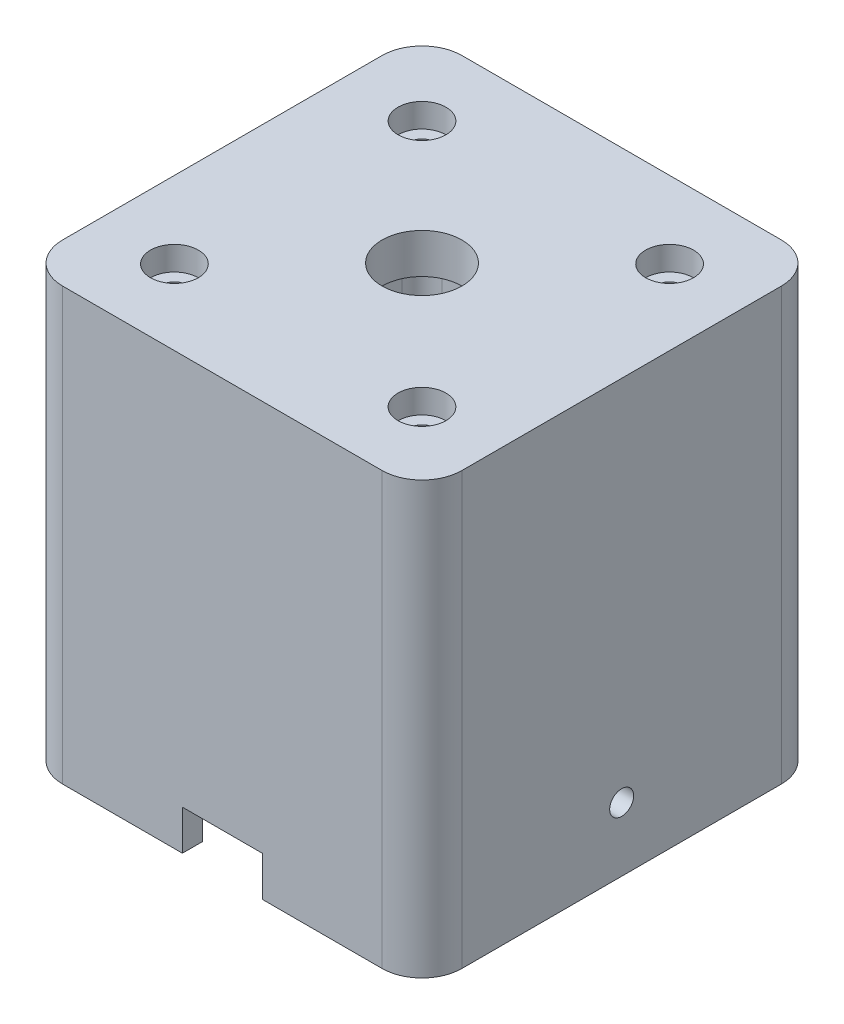
ISO-10303-21;
HEADER;
FILE_DESCRIPTION(('STEP AP214'),'2;1');
FILE_NAME('part.step','',(''),(''),'','','');
FILE_SCHEMA(('AUTOMOTIVE_DESIGN { 1 0 10303 214 1 1 1 1 }'));
ENDSEC;
DATA;
#1=APPLICATION_CONTEXT('core data for automotive mechanical design processes');
#2=APPLICATION_PROTOCOL_DEFINITION('international standard','automotive_design',2000,#1);
#3=PRODUCT_CONTEXT('',#1,'mechanical');
#4=PRODUCT('Part','Part','',(#3));
#5=PRODUCT_RELATED_PRODUCT_CATEGORY('part','',(#4));
#6=PRODUCT_DEFINITION_FORMATION('','',#4);
#7=PRODUCT_DEFINITION_CONTEXT('part definition',#1,'design');
#8=PRODUCT_DEFINITION('design','',#6,#7);
#9=PRODUCT_DEFINITION_SHAPE('','',#8);
#10=(LENGTH_UNIT() NAMED_UNIT(*) SI_UNIT(.MILLI.,.METRE.));
#11=(NAMED_UNIT(*) PLANE_ANGLE_UNIT() SI_UNIT($,.RADIAN.));
#12=(NAMED_UNIT(*) SI_UNIT($,.STERADIAN.) SOLID_ANGLE_UNIT());
#13=UNCERTAINTY_MEASURE_WITH_UNIT(LENGTH_MEASURE(1.E-05),#10,'distance_accuracy_value','');
#14=(GEOMETRIC_REPRESENTATION_CONTEXT(3) GLOBAL_UNCERTAINTY_ASSIGNED_CONTEXT((#13)) GLOBAL_UNIT_ASSIGNED_CONTEXT((#10,
#11,#12)) REPRESENTATION_CONTEXT('',''));
#15=CARTESIAN_POINT('',(0.,0.,0.));
#16=DIRECTION('',(0.,0.,1.));
#17=DIRECTION('',(1.,0.,0.));
#18=AXIS2_PLACEMENT_3D('',#15,#16,#17);
#19=CARTESIAN_POINT('',(-20.,47.,-20.));
#20=DIRECTION('',(0.,-1.,0.));
#21=DIRECTION('',(0.,0.,-1.));
#22=AXIS2_PLACEMENT_3D('',#19,#20,#21);
#23=CYLINDRICAL_SURFACE('',#22,2.5);
#24=DIRECTION('',(0.,1.,0.));
#25=VECTOR('',#24,1.);
#26=CARTESIAN_POINT('',(-22.5,47.,-20.));
#27=LINE('',#26,#25);
#28=CARTESIAN_POINT('',(-22.5,0.,-20.));
#29=VERTEX_POINT('',#28);
#30=CARTESIAN_POINT('',(-22.5,47.,-20.));
#31=VERTEX_POINT('',#30);
#32=EDGE_CURVE('E332',#29,#31,#27,.T.);
#33=ORIENTED_EDGE('',*,*,#32,.F.);
#34=CARTESIAN_POINT('',(-20.,0.,-20.));
#35=DIRECTION('',(0.,1.,0.));
#36=DIRECTION('',(0.,0.,1.));
#37=AXIS2_PLACEMENT_3D('',#34,#35,#36);
#38=CIRCLE('',#37,2.5);
#39=CARTESIAN_POINT('',(-20.,0.,-22.5));
#40=VERTEX_POINT('',#39);
#41=EDGE_CURVE('E339',#29,#40,#38,.F.);
#42=ORIENTED_EDGE('',*,*,#41,.T.);
#43=DIRECTION('',(0.,1.,0.));
#44=VECTOR('',#43,1.);
#45=CARTESIAN_POINT('',(-20.,47.,-22.5));
#46=LINE('',#45,#44);
#47=CARTESIAN_POINT('',(-20.,47.,-22.5));
#48=VERTEX_POINT('',#47);
#49=EDGE_CURVE('E335',#48,#40,#46,.F.);
#50=ORIENTED_EDGE('',*,*,#49,.F.);
#51=CARTESIAN_POINT('',(-20.,47.,-20.));
#52=DIRECTION('',(0.,1.,0.));
#53=DIRECTION('',(0.,0.,1.));
#54=AXIS2_PLACEMENT_3D('',#51,#52,#53);
#55=CIRCLE('',#54,2.5);
#56=EDGE_CURVE('E56',#31,#48,#55,.F.);
#57=ORIENTED_EDGE('',*,*,#56,.F.);
#58=EDGE_LOOP('',(#33,#42,#50,#57));
#59=FACE_BOUND('',#58,.T.);
#60=ADVANCED_FACE('F32',(#59),#23,.F.);
#61=CARTESIAN_POINT('',(20.,47.,-20.));
#62=DIRECTION('',(0.,-1.,0.));
#63=DIRECTION('',(0.,0.,-1.));
#64=AXIS2_PLACEMENT_3D('',#61,#62,#63);
#65=CYLINDRICAL_SURFACE('',#64,2.5);
#66=DIRECTION('',(0.,1.,0.));
#67=VECTOR('',#66,1.);
#68=CARTESIAN_POINT('',(20.,47.,-22.5));
#69=LINE('',#68,#67);
#70=CARTESIAN_POINT('',(20.,0.,-22.5));
#71=VERTEX_POINT('',#70);
#72=CARTESIAN_POINT('',(20.,47.,-22.5));
#73=VERTEX_POINT('',#72);
#74=EDGE_CURVE('E322',#71,#73,#69,.T.);
#75=ORIENTED_EDGE('',*,*,#74,.F.);
#76=CARTESIAN_POINT('',(20.,0.,-20.));
#77=DIRECTION('',(0.,1.,0.));
#78=DIRECTION('',(0.,0.,1.));
#79=AXIS2_PLACEMENT_3D('',#76,#77,#78);
#80=CIRCLE('',#79,2.5);
#81=CARTESIAN_POINT('',(22.5,0.,-20.));
#82=VERTEX_POINT('',#81);
#83=EDGE_CURVE('E330',#71,#82,#80,.F.);
#84=ORIENTED_EDGE('',*,*,#83,.T.);
#85=DIRECTION('',(0.,1.,0.));
#86=VECTOR('',#85,1.);
#87=CARTESIAN_POINT('',(22.5,47.,-20.));
#88=LINE('',#87,#86);
#89=CARTESIAN_POINT('',(22.5,47.,-20.));
#90=VERTEX_POINT('',#89);
#91=EDGE_CURVE('E325',#90,#82,#88,.F.);
#92=ORIENTED_EDGE('',*,*,#91,.F.);
#93=CARTESIAN_POINT('',(20.,47.,-20.));
#94=DIRECTION('',(0.,1.,0.));
#95=DIRECTION('',(0.,0.,1.));
#96=AXIS2_PLACEMENT_3D('',#93,#94,#95);
#97=CIRCLE('',#96,2.5);
#98=EDGE_CURVE('E328',#73,#90,#97,.F.);
#99=ORIENTED_EDGE('',*,*,#98,.F.);
#100=EDGE_LOOP('',(#75,#84,#92,#99));
#101=FACE_BOUND('',#100,.T.);
#102=ADVANCED_FACE('F438',(#101),#65,.F.);
#103=CARTESIAN_POINT('',(20.,47.,20.));
#104=DIRECTION('',(0.,1.,0.));
#105=DIRECTION('',(0.,0.,1.));
#106=AXIS2_PLACEMENT_3D('',#103,#104,#105);
#107=CYLINDRICAL_SURFACE('',#106,2.5);
#108=DIRECTION('',(0.,-1.,0.));
#109=VECTOR('',#108,1.);
#110=CARTESIAN_POINT('',(20.,47.,22.5));
#111=LINE('',#110,#109);
#112=CARTESIAN_POINT('',(20.,47.,22.5));
#113=VERTEX_POINT('',#112);
#114=CARTESIAN_POINT('',(20.,0.,22.5));
#115=VERTEX_POINT('',#114);
#116=EDGE_CURVE('E311',#113,#115,#111,.T.);
#117=ORIENTED_EDGE('',*,*,#116,.F.);
#118=CARTESIAN_POINT('',(20.,47.,20.));
#119=DIRECTION('',(0.,1.,0.));
#120=DIRECTION('',(0.,0.,1.));
#121=AXIS2_PLACEMENT_3D('',#118,#119,#120);
#122=CIRCLE('',#121,2.5);
#123=CARTESIAN_POINT('',(22.5,47.,20.));
#124=VERTEX_POINT('',#123);
#125=EDGE_CURVE('E317',#124,#113,#122,.F.);
#126=ORIENTED_EDGE('',*,*,#125,.F.);
#127=DIRECTION('',(0.,-1.,0.));
#128=VECTOR('',#127,1.);
#129=CARTESIAN_POINT('',(22.5,47.,20.));
#130=LINE('',#129,#128);
#131=CARTESIAN_POINT('',(22.5,0.,20.));
#132=VERTEX_POINT('',#131);
#133=EDGE_CURVE('E314',#132,#124,#130,.F.);
#134=ORIENTED_EDGE('',*,*,#133,.F.);
#135=CARTESIAN_POINT('',(20.,0.,20.));
#136=DIRECTION('',(0.,1.,0.));
#137=DIRECTION('',(0.,0.,1.));
#138=AXIS2_PLACEMENT_3D('',#135,#136,#137);
#139=CIRCLE('',#138,2.5);
#140=EDGE_CURVE('E319',#132,#115,#139,.F.);
#141=ORIENTED_EDGE('',*,*,#140,.T.);
#142=EDGE_LOOP('',(#117,#126,#134,#141));
#143=FACE_BOUND('',#142,.T.);
#144=ADVANCED_FACE('F429',(#143),#107,.F.);
#145=CARTESIAN_POINT('',(-20.,47.,20.));
#146=DIRECTION('',(0.,1.,0.));
#147=DIRECTION('',(0.,0.,1.));
#148=AXIS2_PLACEMENT_3D('',#145,#146,#147);
#149=CYLINDRICAL_SURFACE('',#148,2.5);
#150=DIRECTION('',(0.,-1.,0.));
#151=VECTOR('',#150,1.);
#152=CARTESIAN_POINT('',(-22.5,47.,20.));
#153=LINE('',#152,#151);
#154=CARTESIAN_POINT('',(-22.5,47.,20.));
#155=VERTEX_POINT('',#154);
#156=CARTESIAN_POINT('',(-22.5,0.,20.));
#157=VERTEX_POINT('',#156);
#158=EDGE_CURVE('E299',#155,#157,#153,.T.);
#159=ORIENTED_EDGE('',*,*,#158,.F.);
#160=CARTESIAN_POINT('',(-20.,47.,20.));
#161=DIRECTION('',(0.,1.,0.));
#162=DIRECTION('',(0.,0.,1.));
#163=AXIS2_PLACEMENT_3D('',#160,#161,#162);
#164=CIRCLE('',#163,2.5);
#165=CARTESIAN_POINT('',(-20.,47.,22.5));
#166=VERTEX_POINT('',#165);
#167=EDGE_CURVE('E305',#166,#155,#164,.F.);
#168=ORIENTED_EDGE('',*,*,#167,.F.);
#169=DIRECTION('',(0.,-1.,0.));
#170=VECTOR('',#169,1.);
#171=CARTESIAN_POINT('',(-20.,47.,22.5));
#172=LINE('',#171,#170);
#173=CARTESIAN_POINT('',(-20.,0.,22.5));
#174=VERTEX_POINT('',#173);
#175=EDGE_CURVE('E302',#174,#166,#172,.F.);
#176=ORIENTED_EDGE('',*,*,#175,.F.);
#177=CARTESIAN_POINT('',(-20.,0.,20.));
#178=DIRECTION('',(0.,1.,0.));
#179=DIRECTION('',(0.,0.,1.));
#180=AXIS2_PLACEMENT_3D('',#177,#178,#179);
#181=CIRCLE('',#180,2.5);
#182=EDGE_CURVE('E308',#174,#157,#181,.F.);
#183=ORIENTED_EDGE('',*,*,#182,.T.);
#184=EDGE_LOOP('',(#159,#168,#176,#183));
#185=FACE_BOUND('',#184,.T.);
#186=ADVANCED_FACE('F449',(#185),#149,.F.);
#187=CARTESIAN_POINT('',(-20.,47.,20.));
#188=DIRECTION('',(0.,-1.,0.));
#189=DIRECTION('',(0.,0.,-1.));
#190=AXIS2_PLACEMENT_3D('',#187,#188,#189);
#191=CYLINDRICAL_SURFACE('',#190,5.);
#192=DIRECTION('',(0.,-1.,0.));
#193=VECTOR('',#192,1.);
#194=CARTESIAN_POINT('',(-20.,47.,25.));
#195=LINE('',#194,#193);
#196=CARTESIAN_POINT('',(-20.,54.,25.));
#197=VERTEX_POINT('',#196);
#198=CARTESIAN_POINT('',(-20.,0.,25.));
#199=VERTEX_POINT('',#198);
#200=EDGE_CURVE('E289',#197,#199,#195,.T.);
#201=ORIENTED_EDGE('',*,*,#200,.F.);
#202=CARTESIAN_POINT('',(-20.,54.,20.));
#203=DIRECTION('',(0.,1.,0.));
#204=DIRECTION('',(0.,0.,1.));
#205=AXIS2_PLACEMENT_3D('',#202,#203,#204);
#206=CIRCLE('',#205,5.);
#207=CARTESIAN_POINT('',(-25.,54.,20.));
#208=VERTEX_POINT('',#207);
#209=EDGE_CURVE('E295',#208,#197,#206,.T.);
#210=ORIENTED_EDGE('',*,*,#209,.F.);
#211=DIRECTION('',(0.,-1.,0.));
#212=VECTOR('',#211,1.);
#213=CARTESIAN_POINT('',(-25.,47.,20.));
#214=LINE('',#213,#212);
#215=CARTESIAN_POINT('',(-25.,0.,20.));
#216=VERTEX_POINT('',#215);
#217=EDGE_CURVE('E292',#216,#208,#214,.F.);
#218=ORIENTED_EDGE('',*,*,#217,.F.);
#219=CARTESIAN_POINT('',(-20.,0.,20.));
#220=DIRECTION('',(0.,1.,0.));
#221=DIRECTION('',(0.,0.,1.));
#222=AXIS2_PLACEMENT_3D('',#219,#220,#221);
#223=CIRCLE('',#222,5.);
#224=EDGE_CURVE('E297',#199,#216,#223,.F.);
#225=ORIENTED_EDGE('',*,*,#224,.F.);
#226=EDGE_LOOP('',(#201,#210,#218,#225));
#227=FACE_BOUND('',#226,.T.);
#228=ADVANCED_FACE('F477',(#227),#191,.T.);
#229=CARTESIAN_POINT('',(-20.,47.,-20.));
#230=DIRECTION('',(0.,1.,0.));
#231=DIRECTION('',(0.,0.,1.));
#232=AXIS2_PLACEMENT_3D('',#229,#230,#231);
#233=CYLINDRICAL_SURFACE('',#232,5.);
#234=DIRECTION('',(0.,1.,0.));
#235=VECTOR('',#234,1.);
#236=CARTESIAN_POINT('',(-20.,47.,-25.));
#237=LINE('',#236,#235);
#238=CARTESIAN_POINT('',(-20.,0.,-25.));
#239=VERTEX_POINT('',#238);
#240=CARTESIAN_POINT('',(-20.,54.,-25.));
#241=VERTEX_POINT('',#240);
#242=EDGE_CURVE('E279',#239,#241,#237,.T.);
#243=ORIENTED_EDGE('',*,*,#242,.F.);
#244=CARTESIAN_POINT('',(-20.,0.,-20.));
#245=DIRECTION('',(0.,1.,0.));
#246=DIRECTION('',(0.,0.,1.));
#247=AXIS2_PLACEMENT_3D('',#244,#245,#246);
#248=CIRCLE('',#247,5.);
#249=CARTESIAN_POINT('',(-25.,0.,-20.));
#250=VERTEX_POINT('',#249);
#251=EDGE_CURVE('E285',#250,#239,#248,.F.);
#252=ORIENTED_EDGE('',*,*,#251,.F.);
#253=DIRECTION('',(0.,1.,0.));
#254=VECTOR('',#253,1.);
#255=CARTESIAN_POINT('',(-25.,47.,-20.));
#256=LINE('',#255,#254);
#257=CARTESIAN_POINT('',(-25.,54.,-20.));
#258=VERTEX_POINT('',#257);
#259=EDGE_CURVE('E282',#258,#250,#256,.F.);
#260=ORIENTED_EDGE('',*,*,#259,.F.);
#261=CARTESIAN_POINT('',(-20.,54.,-20.));
#262=DIRECTION('',(0.,1.,0.));
#263=DIRECTION('',(0.,0.,1.));
#264=AXIS2_PLACEMENT_3D('',#261,#262,#263);
#265=CIRCLE('',#264,5.);
#266=EDGE_CURVE('E287',#241,#258,#265,.T.);
#267=ORIENTED_EDGE('',*,*,#266,.F.);
#268=EDGE_LOOP('',(#243,#252,#260,#267));
#269=FACE_BOUND('',#268,.T.);
#270=ADVANCED_FACE('F480',(#269),#233,.T.);
#271=CARTESIAN_POINT('',(20.,47.,-20.));
#272=DIRECTION('',(0.,1.,0.));
#273=DIRECTION('',(0.,0.,1.));
#274=AXIS2_PLACEMENT_3D('',#271,#272,#273);
#275=CYLINDRICAL_SURFACE('',#274,5.);
#276=DIRECTION('',(0.,1.,0.));
#277=VECTOR('',#276,1.);
#278=CARTESIAN_POINT('',(25.,47.,-20.));
#279=LINE('',#278,#277);
#280=CARTESIAN_POINT('',(25.,0.,-20.));
#281=VERTEX_POINT('',#280);
#282=CARTESIAN_POINT('',(25.,54.,-20.));
#283=VERTEX_POINT('',#282);
#284=EDGE_CURVE('E269',#281,#283,#279,.T.);
#285=ORIENTED_EDGE('',*,*,#284,.F.);
#286=CARTESIAN_POINT('',(20.,0.,-20.));
#287=DIRECTION('',(0.,1.,0.));
#288=DIRECTION('',(0.,0.,1.));
#289=AXIS2_PLACEMENT_3D('',#286,#287,#288);
#290=CIRCLE('',#289,5.);
#291=CARTESIAN_POINT('',(20.,0.,-25.));
#292=VERTEX_POINT('',#291);
#293=EDGE_CURVE('E275',#292,#281,#290,.F.);
#294=ORIENTED_EDGE('',*,*,#293,.F.);
#295=DIRECTION('',(0.,1.,0.));
#296=VECTOR('',#295,1.);
#297=CARTESIAN_POINT('',(20.,47.,-25.));
#298=LINE('',#297,#296);
#299=CARTESIAN_POINT('',(20.,54.,-25.));
#300=VERTEX_POINT('',#299);
#301=EDGE_CURVE('E272',#300,#292,#298,.F.);
#302=ORIENTED_EDGE('',*,*,#301,.F.);
#303=CARTESIAN_POINT('',(20.,54.,-20.));
#304=DIRECTION('',(0.,1.,0.));
#305=DIRECTION('',(0.,0.,1.));
#306=AXIS2_PLACEMENT_3D('',#303,#304,#305);
#307=CIRCLE('',#306,5.);
#308=EDGE_CURVE('E277',#283,#300,#307,.T.);
#309=ORIENTED_EDGE('',*,*,#308,.F.);
#310=EDGE_LOOP('',(#285,#294,#302,#309));
#311=FACE_BOUND('',#310,.T.);
#312=ADVANCED_FACE('F415',(#311),#275,.T.);
#313=CARTESIAN_POINT('',(20.,47.,20.));
#314=DIRECTION('',(0.,1.,0.));
#315=DIRECTION('',(0.,0.,1.));
#316=AXIS2_PLACEMENT_3D('',#313,#314,#315);
#317=CYLINDRICAL_SURFACE('',#316,5.);
#318=DIRECTION('',(0.,1.,0.));
#319=VECTOR('',#318,1.);
#320=CARTESIAN_POINT('',(20.,47.,25.));
#321=LINE('',#320,#319);
#322=CARTESIAN_POINT('',(20.,0.,25.));
#323=VERTEX_POINT('',#322);
#324=CARTESIAN_POINT('',(20.,54.,25.));
#325=VERTEX_POINT('',#324);
#326=EDGE_CURVE('E258',#323,#325,#321,.T.);
#327=ORIENTED_EDGE('',*,*,#326,.F.);
#328=CARTESIAN_POINT('',(20.,0.,20.));
#329=DIRECTION('',(0.,1.,0.));
#330=DIRECTION('',(0.,0.,1.));
#331=AXIS2_PLACEMENT_3D('',#328,#329,#330);
#332=CIRCLE('',#331,5.);
#333=CARTESIAN_POINT('',(25.,0.,20.));
#334=VERTEX_POINT('',#333);
#335=EDGE_CURVE('E264',#334,#323,#332,.F.);
#336=ORIENTED_EDGE('',*,*,#335,.F.);
#337=DIRECTION('',(0.,1.,0.));
#338=VECTOR('',#337,1.);
#339=CARTESIAN_POINT('',(25.,47.,20.));
#340=LINE('',#339,#338);
#341=CARTESIAN_POINT('',(25.,54.,20.));
#342=VERTEX_POINT('',#341);
#343=EDGE_CURVE('E261',#342,#334,#340,.F.);
#344=ORIENTED_EDGE('',*,*,#343,.F.);
#345=CARTESIAN_POINT('',(20.,54.,20.));
#346=DIRECTION('',(0.,1.,0.));
#347=DIRECTION('',(0.,0.,1.));
#348=AXIS2_PLACEMENT_3D('',#345,#346,#347);
#349=CIRCLE('',#348,5.);
#350=EDGE_CURVE('E267',#325,#342,#349,.T.);
#351=ORIENTED_EDGE('',*,*,#350,.F.);
#352=EDGE_LOOP('',(#327,#336,#344,#351));
#353=FACE_BOUND('',#352,.T.);
#354=ADVANCED_FACE('F422',(#353),#317,.T.);
#355=CARTESIAN_POINT('',(0.,0.,0.));
#356=DIRECTION('',(0.,1.,0.));
#357=DIRECTION('',(0.,0.,1.));
#358=AXIS2_PLACEMENT_3D('',#355,#356,#357);
#359=PLANE('',#358);
#360=DIRECTION('',(1.,0.,0.));
#361=VECTOR('',#360,1.);
#362=CARTESIAN_POINT('',(-25.,0.,25.));
#363=LINE('',#362,#361);
#364=CARTESIAN_POINT('',(5.,0.,25.));
#365=VERTEX_POINT('',#364);
#366=EDGE_CURVE('E255',#365,#323,#363,.T.);
#367=ORIENTED_EDGE('',*,*,#366,.F.);
#368=DIRECTION('',(0.,0.,1.));
#369=VECTOR('',#368,1.);
#370=CARTESIAN_POINT('',(5.,0.,12.));
#371=LINE('',#370,#369);
#372=CARTESIAN_POINT('',(5.,0.,22.5));
#373=VERTEX_POINT('',#372);
#374=EDGE_CURVE('E184',#373,#365,#371,.T.);
#375=ORIENTED_EDGE('',*,*,#374,.F.);
#376=DIRECTION('',(1.,0.,0.));
#377=VECTOR('',#376,1.);
#378=CARTESIAN_POINT('',(-22.5,0.,22.5));
#379=LINE('',#378,#377);
#380=EDGE_CURVE('E244',#373,#115,#379,.T.);
#381=ORIENTED_EDGE('',*,*,#380,.T.);
#382=ORIENTED_EDGE('',*,*,#140,.F.);
#383=DIRECTION('',(0.,0.,-1.));
#384=VECTOR('',#383,1.);
#385=CARTESIAN_POINT('',(22.5,0.,-22.5));
#386=LINE('',#385,#384);
#387=EDGE_CURVE('E223',#132,#82,#386,.T.);
#388=ORIENTED_EDGE('',*,*,#387,.T.);
#389=ORIENTED_EDGE('',*,*,#83,.F.);
#390=DIRECTION('',(-1.,0.,0.));
#391=VECTOR('',#390,1.);
#392=CARTESIAN_POINT('',(-22.5,0.,-22.5));
#393=LINE('',#392,#391);
#394=EDGE_CURVE('E239',#71,#40,#393,.T.);
#395=ORIENTED_EDGE('',*,*,#394,.T.);
#396=ORIENTED_EDGE('',*,*,#41,.F.);
#397=DIRECTION('',(0.,0.,1.));
#398=VECTOR('',#397,1.);
#399=CARTESIAN_POINT('',(-22.5,0.,-22.5));
#400=LINE('',#399,#398);
#401=EDGE_CURVE('E242',#29,#157,#400,.T.);
#402=ORIENTED_EDGE('',*,*,#401,.T.);
#403=ORIENTED_EDGE('',*,*,#182,.F.);
#404=CARTESIAN_POINT('',(-5.,0.,22.5));
#405=VERTEX_POINT('',#404);
#406=EDGE_CURVE('E228',#174,#405,#379,.T.);
#407=ORIENTED_EDGE('',*,*,#406,.T.);
#408=DIRECTION('',(0.,0.,1.));
#409=VECTOR('',#408,1.);
#410=CARTESIAN_POINT('',(-5.,0.,12.));
#411=LINE('',#410,#409);
#412=CARTESIAN_POINT('',(-5.,0.,25.));
#413=VERTEX_POINT('',#412);
#414=EDGE_CURVE('E197',#405,#413,#411,.T.);
#415=ORIENTED_EDGE('',*,*,#414,.T.);
#416=EDGE_CURVE('E256',#199,#413,#363,.T.);
#417=ORIENTED_EDGE('',*,*,#416,.F.);
#418=ORIENTED_EDGE('',*,*,#224,.T.);
#419=DIRECTION('',(0.,0.,1.));
#420=VECTOR('',#419,1.);
#421=CARTESIAN_POINT('',(-25.,0.,-25.));
#422=LINE('',#421,#420);
#423=EDGE_CURVE('E252',#250,#216,#422,.T.);
#424=ORIENTED_EDGE('',*,*,#423,.F.);
#425=ORIENTED_EDGE('',*,*,#251,.T.);
#426=DIRECTION('',(-1.,0.,0.));
#427=VECTOR('',#426,1.);
#428=CARTESIAN_POINT('',(-25.,0.,-25.));
#429=LINE('',#428,#427);
#430=EDGE_CURVE('E249',#292,#239,#429,.T.);
#431=ORIENTED_EDGE('',*,*,#430,.F.);
#432=ORIENTED_EDGE('',*,*,#293,.T.);
#433=DIRECTION('',(0.,0.,-1.));
#434=VECTOR('',#433,1.);
#435=CARTESIAN_POINT('',(25.,0.,-25.));
#436=LINE('',#435,#434);
#437=EDGE_CURVE('E236',#334,#281,#436,.T.);
#438=ORIENTED_EDGE('',*,*,#437,.F.);
#439=ORIENTED_EDGE('',*,*,#335,.T.);
#440=EDGE_LOOP('',(#367,#375,#381,#382,#388,#389,#395,#396,#402,#403,#407,#415,#417,#418,#424,
#425,#431,#432,#438,#439));
#441=FACE_BOUND('',#440,.T.);
#442=ADVANCED_FACE('F404',(#441),#359,.F.);
#443=CARTESIAN_POINT('',(25.,47.,-25.));
#444=DIRECTION('',(-1.,0.,0.));
#445=DIRECTION('',(0.,0.,1.));
#446=AXIS2_PLACEMENT_3D('',#443,#444,#445);
#447=PLANE('',#446);
#448=CARTESIAN_POINT('',(25.,8.,1.05518735688169E-13));
#449=DIRECTION('',(1.,0.,0.));
#450=DIRECTION('',(0.,0.,-1.));
#451=AXIS2_PLACEMENT_3D('',#448,#449,#450);
#452=CIRCLE('',#451,1.50000000000002);
#453=CARTESIAN_POINT('',(25.,8.,-1.49999999999991));
#454=VERTEX_POINT('',#453);
#455=EDGE_CURVE('E345',#454,#454,#452,.T.);
#456=ORIENTED_EDGE('',*,*,#455,.F.);
#457=EDGE_LOOP('',(#456));
#458=FACE_BOUND('',#457,.T.);
#459=ORIENTED_EDGE('',*,*,#437,.T.);
#460=ORIENTED_EDGE('',*,*,#284,.T.);
#461=DIRECTION('',(0.,0.,-1.));
#462=VECTOR('',#461,1.);
#463=CARTESIAN_POINT('',(25.,54.,-25.));
#464=LINE('',#463,#462);
#465=EDGE_CURVE('E210',#342,#283,#464,.T.);
#466=ORIENTED_EDGE('',*,*,#465,.F.);
#467=ORIENTED_EDGE('',*,*,#343,.T.);
#468=EDGE_LOOP('',(#459,#460,#466,#467));
#469=FACE_BOUND('',#468,.T.);
#470=ADVANCED_FACE('F400',(#458,#469),#447,.F.);
#471=CARTESIAN_POINT('',(-25.,47.,-25.));
#472=DIRECTION('',(0.,0.,1.));
#473=DIRECTION('',(1.,0.,0.));
#474=AXIS2_PLACEMENT_3D('',#471,#472,#473);
#475=PLANE('',#474);
#476=CARTESIAN_POINT('',(3.67379836101404E-13,8.,-25.));
#477=DIRECTION('',(0.,0.,-1.));
#478=DIRECTION('',(-1.,0.,0.));
#479=AXIS2_PLACEMENT_3D('',#476,#477,#478);
#480=CIRCLE('',#479,1.50000000000002);
#481=CARTESIAN_POINT('',(-1.49999999999965,8.,-25.));
#482=VERTEX_POINT('',#481);
#483=EDGE_CURVE('E356',#482,#482,#480,.T.);
#484=ORIENTED_EDGE('',*,*,#483,.F.);
#485=EDGE_LOOP('',(#484));
#486=FACE_BOUND('',#485,.T.);
#487=ORIENTED_EDGE('',*,*,#430,.T.);
#488=ORIENTED_EDGE('',*,*,#242,.T.);
#489=DIRECTION('',(-1.,0.,0.));
#490=VECTOR('',#489,1.);
#491=CARTESIAN_POINT('',(-25.,54.,-25.));
#492=LINE('',#491,#490);
#493=EDGE_CURVE('E215',#300,#241,#492,.T.);
#494=ORIENTED_EDGE('',*,*,#493,.F.);
#495=ORIENTED_EDGE('',*,*,#301,.T.);
#496=EDGE_LOOP('',(#487,#488,#494,#495));
#497=FACE_BOUND('',#496,.T.);
#498=ADVANCED_FACE('F403',(#486,#497),#475,.F.);
#499=CARTESIAN_POINT('',(-25.,47.,-25.));
#500=DIRECTION('',(1.,0.,0.));
#501=DIRECTION('',(0.,0.,-1.));
#502=AXIS2_PLACEMENT_3D('',#499,#500,#501);
#503=PLANE('',#502);
#504=CARTESIAN_POINT('',(-25.,8.,-1.05518735688169E-13));
#505=DIRECTION('',(-1.,0.,0.));
#506=DIRECTION('',(0.,0.,1.));
#507=AXIS2_PLACEMENT_3D('',#504,#505,#506);
#508=CIRCLE('',#507,1.50000000000002);
#509=CARTESIAN_POINT('',(-25.,8.,1.49999999999991));
#510=VERTEX_POINT('',#509);
#511=EDGE_CURVE('E350',#510,#510,#508,.T.);
#512=ORIENTED_EDGE('',*,*,#511,.F.);
#513=EDGE_LOOP('',(#512));
#514=FACE_BOUND('',#513,.T.);
#515=ORIENTED_EDGE('',*,*,#423,.T.);
#516=ORIENTED_EDGE('',*,*,#217,.T.);
#517=DIRECTION('',(0.,0.,1.));
#518=VECTOR('',#517,1.);
#519=CARTESIAN_POINT('',(-25.,54.,-25.));
#520=LINE('',#519,#518);
#521=EDGE_CURVE('E218',#258,#208,#520,.T.);
#522=ORIENTED_EDGE('',*,*,#521,.F.);
#523=ORIENTED_EDGE('',*,*,#259,.T.);
#524=EDGE_LOOP('',(#515,#516,#522,#523));
#525=FACE_BOUND('',#524,.T.);
#526=ADVANCED_FACE('F491',(#514,#525),#503,.F.);
#527=CARTESIAN_POINT('',(-25.,47.,25.));
#528=DIRECTION('',(0.,0.,-1.));
#529=DIRECTION('',(-1.,0.,0.));
#530=AXIS2_PLACEMENT_3D('',#527,#528,#529);
#531=PLANE('',#530);
#532=DIRECTION('',(-1.,0.,0.));
#533=VECTOR('',#532,1.);
#534=CARTESIAN_POINT('',(-5.,5.,25.));
#535=LINE('',#534,#533);
#536=CARTESIAN_POINT('',(5.,5.,25.));
#537=VERTEX_POINT('',#536);
#538=CARTESIAN_POINT('',(-5.,5.,25.));
#539=VERTEX_POINT('',#538);
#540=EDGE_CURVE('E172',#537,#539,#535,.T.);
#541=ORIENTED_EDGE('',*,*,#540,.F.);
#542=DIRECTION('',(0.,1.,0.));
#543=VECTOR('',#542,1.);
#544=CARTESIAN_POINT('',(5.,5.,25.));
#545=LINE('',#544,#543);
#546=EDGE_CURVE('E181',#365,#537,#545,.T.);
#547=ORIENTED_EDGE('',*,*,#546,.F.);
#548=ORIENTED_EDGE('',*,*,#366,.T.);
#549=ORIENTED_EDGE('',*,*,#326,.T.);
#550=DIRECTION('',(1.,0.,0.));
#551=VECTOR('',#550,1.);
#552=CARTESIAN_POINT('',(-25.,54.,25.));
#553=LINE('',#552,#551);
#554=EDGE_CURVE('E221',#197,#325,#553,.T.);
#555=ORIENTED_EDGE('',*,*,#554,.F.);
#556=ORIENTED_EDGE('',*,*,#200,.T.);
#557=ORIENTED_EDGE('',*,*,#416,.T.);
#558=DIRECTION('',(0.,-1.,0.));
#559=VECTOR('',#558,1.);
#560=CARTESIAN_POINT('',(-5.,5.,25.));
#561=LINE('',#560,#559);
#562=EDGE_CURVE('E178',#539,#413,#561,.T.);
#563=ORIENTED_EDGE('',*,*,#562,.F.);
#564=EDGE_LOOP('',(#541,#547,#548,#549,#555,#556,#557,#563));
#565=FACE_BOUND('',#564,.T.);
#566=ADVANCED_FACE('F189',(#565),#531,.F.);
#567=CARTESIAN_POINT('',(22.5,47.,-22.5));
#568=DIRECTION('',(-1.,0.,0.));
#569=DIRECTION('',(0.,0.,1.));
#570=AXIS2_PLACEMENT_3D('',#567,#568,#569);
#571=PLANE('',#570);
#572=CARTESIAN_POINT('',(22.5,8.,1.05865680383364E-13));
#573=DIRECTION('',(-1.,0.,0.));
#574=DIRECTION('',(0.,0.,1.));
#575=AXIS2_PLACEMENT_3D('',#572,#573,#574);
#576=CIRCLE('',#575,1.50000000000002);
#577=CARTESIAN_POINT('',(22.5,8.,1.50000000000012));
#578=VERTEX_POINT('',#577);
#579=EDGE_CURVE('E187',#578,#578,#576,.T.);
#580=ORIENTED_EDGE('',*,*,#579,.F.);
#581=EDGE_LOOP('',(#580));
#582=FACE_BOUND('',#581,.T.);
#583=DIRECTION('',(0.,0.,-1.));
#584=VECTOR('',#583,1.);
#585=CARTESIAN_POINT('',(22.5,47.,-22.5));
#586=LINE('',#585,#584);
#587=EDGE_CURVE('E224',#124,#90,#586,.T.);
#588=ORIENTED_EDGE('',*,*,#587,.T.);
#589=ORIENTED_EDGE('',*,*,#91,.T.);
#590=ORIENTED_EDGE('',*,*,#387,.F.);
#591=ORIENTED_EDGE('',*,*,#133,.T.);
#592=EDGE_LOOP('',(#588,#589,#590,#591));
#593=FACE_BOUND('',#592,.T.);
#594=ADVANCED_FACE('F434',(#582,#593),#571,.T.);
#595=CARTESIAN_POINT('',(-22.5,47.,-22.5));
#596=DIRECTION('',(0.,0.,1.));
#597=DIRECTION('',(1.,0.,0.));
#598=AXIS2_PLACEMENT_3D('',#595,#596,#597);
#599=PLANE('',#598);
#600=CARTESIAN_POINT('',(3.41540670755275E-13,8.,-22.5));
#601=DIRECTION('',(0.,0.,1.));
#602=DIRECTION('',(1.,0.,0.));
#603=AXIS2_PLACEMENT_3D('',#600,#601,#602);
#604=CIRCLE('',#603,1.50000000000002);
#605=CARTESIAN_POINT('',(1.50000000000036,8.,-22.5));
#606=VERTEX_POINT('',#605);
#607=EDGE_CURVE('E349',#606,#606,#604,.T.);
#608=ORIENTED_EDGE('',*,*,#607,.F.);
#609=EDGE_LOOP('',(#608));
#610=FACE_BOUND('',#609,.T.);
#611=DIRECTION('',(-1.,0.,0.));
#612=VECTOR('',#611,1.);
#613=CARTESIAN_POINT('',(-22.5,47.,-22.5));
#614=LINE('',#613,#612);
#615=EDGE_CURVE('E227',#73,#48,#614,.T.);
#616=ORIENTED_EDGE('',*,*,#615,.T.);
#617=ORIENTED_EDGE('',*,*,#49,.T.);
#618=ORIENTED_EDGE('',*,*,#394,.F.);
#619=ORIENTED_EDGE('',*,*,#74,.T.);
#620=EDGE_LOOP('',(#616,#617,#618,#619));
#621=FACE_BOUND('',#620,.T.);
#622=ADVANCED_FACE('F441',(#610,#621),#599,.T.);
#623=CARTESIAN_POINT('',(-22.5,47.,-22.5));
#624=DIRECTION('',(1.,0.,0.));
#625=DIRECTION('',(0.,0.,-1.));
#626=AXIS2_PLACEMENT_3D('',#623,#624,#625);
#627=PLANE('',#626);
#628=CARTESIAN_POINT('',(-22.5,8.,-1.05865680383364E-13));
#629=DIRECTION('',(1.,0.,0.));
#630=DIRECTION('',(0.,0.,-1.));
#631=AXIS2_PLACEMENT_3D('',#628,#629,#630);
#632=CIRCLE('',#631,1.50000000000002);
#633=CARTESIAN_POINT('',(-22.5,8.,-1.50000000000012));
#634=VERTEX_POINT('',#633);
#635=EDGE_CURVE('E346',#634,#634,#632,.T.);
#636=ORIENTED_EDGE('',*,*,#635,.F.);
#637=EDGE_LOOP('',(#636));
#638=FACE_BOUND('',#637,.T.);
#639=ORIENTED_EDGE('',*,*,#401,.F.);
#640=ORIENTED_EDGE('',*,*,#32,.T.);
#641=DIRECTION('',(0.,0.,1.));
#642=VECTOR('',#641,1.);
#643=CARTESIAN_POINT('',(-22.5,47.,-22.5));
#644=LINE('',#643,#642);
#645=EDGE_CURVE('E231',#31,#155,#644,.T.);
#646=ORIENTED_EDGE('',*,*,#645,.T.);
#647=ORIENTED_EDGE('',*,*,#158,.T.);
#648=EDGE_LOOP('',(#639,#640,#646,#647));
#649=FACE_BOUND('',#648,.T.);
#650=ADVANCED_FACE('F446',(#638,#649),#627,.T.);
#651=CARTESIAN_POINT('',(-22.5,47.,22.5));
#652=DIRECTION('',(0.,0.,-1.));
#653=DIRECTION('',(-1.,0.,0.));
#654=AXIS2_PLACEMENT_3D('',#651,#652,#653);
#655=PLANE('',#654);
#656=DIRECTION('',(0.,-1.,0.));
#657=VECTOR('',#656,1.);
#658=CARTESIAN_POINT('',(4.99999999999999,47.,22.5));
#659=LINE('',#658,#657);
#660=CARTESIAN_POINT('',(5.,5.,22.5));
#661=VERTEX_POINT('',#660);
#662=EDGE_CURVE('E11',#661,#373,#659,.T.);
#663=ORIENTED_EDGE('',*,*,#662,.F.);
#664=DIRECTION('',(1.,0.,0.));
#665=VECTOR('',#664,1.);
#666=CARTESIAN_POINT('',(-22.5,5.,22.5));
#667=LINE('',#666,#665);
#668=CARTESIAN_POINT('',(-5.,5.,22.5));
#669=VERTEX_POINT('',#668);
#670=EDGE_CURVE('E175',#669,#661,#667,.T.);
#671=ORIENTED_EDGE('',*,*,#670,.F.);
#672=DIRECTION('',(0.,1.,0.));
#673=VECTOR('',#672,1.);
#674=CARTESIAN_POINT('',(-5.,47.,22.5));
#675=LINE('',#674,#673);
#676=EDGE_CURVE('E40',#405,#669,#675,.T.);
#677=ORIENTED_EDGE('',*,*,#676,.F.);
#678=ORIENTED_EDGE('',*,*,#406,.F.);
#679=ORIENTED_EDGE('',*,*,#175,.T.);
#680=DIRECTION('',(1.,0.,0.));
#681=VECTOR('',#680,1.);
#682=CARTESIAN_POINT('',(-22.5,47.,22.5));
#683=LINE('',#682,#681);
#684=EDGE_CURVE('E233',#166,#113,#683,.T.);
#685=ORIENTED_EDGE('',*,*,#684,.T.);
#686=ORIENTED_EDGE('',*,*,#116,.T.);
#687=ORIENTED_EDGE('',*,*,#380,.F.);
#688=EDGE_LOOP('',(#663,#671,#677,#678,#679,#685,#686,#687));
#689=FACE_BOUND('',#688,.T.);
#690=ADVANCED_FACE('F425',(#689),#655,.T.);
#691=CARTESIAN_POINT('',(0.,47.,0.));
#692=DIRECTION('',(0.,1.,0.));
#693=DIRECTION('',(0.,0.,1.));
#694=AXIS2_PLACEMENT_3D('',#691,#692,#693);
#695=PLANE('',#694);
#696=CARTESIAN_POINT('',(-15.4,47.,-15.4));
#697=DIRECTION('',(0.,1.,0.));
#698=DIRECTION('',(0.,0.,1.));
#699=AXIS2_PLACEMENT_3D('',#696,#697,#698);
#700=CIRCLE('',#699,1.50000000000001);
#701=CARTESIAN_POINT('',(-15.4,47.,-13.9));
#702=VERTEX_POINT('',#701);
#703=EDGE_CURVE('E35',#702,#702,#700,.T.);
#704=ORIENTED_EDGE('',*,*,#703,.T.);
#705=EDGE_LOOP('',(#704));
#706=FACE_BOUND('',#705,.T.);
#707=CARTESIAN_POINT('',(15.6,47.,-15.4));
#708=DIRECTION('',(0.,1.,0.));
#709=DIRECTION('',(0.,0.,1.));
#710=AXIS2_PLACEMENT_3D('',#707,#708,#709);
#711=CIRCLE('',#710,1.50000000000001);
#712=CARTESIAN_POINT('',(15.6,47.,-13.9));
#713=VERTEX_POINT('',#712);
#714=EDGE_CURVE('E362',#713,#713,#711,.T.);
#715=ORIENTED_EDGE('',*,*,#714,.T.);
#716=EDGE_LOOP('',(#715));
#717=FACE_BOUND('',#716,.T.);
#718=CARTESIAN_POINT('',(15.6000000000003,47.,15.6));
#719=DIRECTION('',(0.,1.,0.));
#720=DIRECTION('',(0.,0.,1.));
#721=AXIS2_PLACEMENT_3D('',#718,#719,#720);
#722=CIRCLE('',#721,1.50000000000001);
#723=CARTESIAN_POINT('',(15.6000000000003,47.,17.1));
#724=VERTEX_POINT('',#723);
#725=EDGE_CURVE('E358',#724,#724,#722,.T.);
#726=ORIENTED_EDGE('',*,*,#725,.T.);
#727=EDGE_LOOP('',(#726));
#728=FACE_BOUND('',#727,.T.);
#729=CARTESIAN_POINT('',(-15.3999999999997,47.,15.6));
#730=DIRECTION('',(0.,1.,0.));
#731=DIRECTION('',(0.,0.,1.));
#732=AXIS2_PLACEMENT_3D('',#729,#730,#731);
#733=CIRCLE('',#732,1.50000000000001);
#734=CARTESIAN_POINT('',(-15.3999999999997,47.,17.1));
#735=VERTEX_POINT('',#734);
#736=EDGE_CURVE('E353',#735,#735,#733,.T.);
#737=ORIENTED_EDGE('',*,*,#736,.T.);
#738=EDGE_LOOP('',(#737));
#739=FACE_BOUND('',#738,.T.);
#740=CARTESIAN_POINT('',(0.,47.,0.));
#741=DIRECTION('',(0.,-1.,0.));
#742=DIRECTION('',(0.,0.,-1.));
#743=AXIS2_PLACEMENT_3D('',#740,#741,#742);
#744=CIRCLE('',#743,11.5);
#745=CARTESIAN_POINT('',(0.,47.,-11.5));
#746=VERTEX_POINT('',#745);
#747=EDGE_CURVE('E204',#746,#746,#744,.T.);
#748=ORIENTED_EDGE('',*,*,#747,.F.);
#749=EDGE_LOOP('',(#748));
#750=FACE_BOUND('',#749,.T.);
#751=ORIENTED_EDGE('',*,*,#645,.F.);
#752=ORIENTED_EDGE('',*,*,#56,.T.);
#753=ORIENTED_EDGE('',*,*,#615,.F.);
#754=ORIENTED_EDGE('',*,*,#98,.T.);
#755=ORIENTED_EDGE('',*,*,#587,.F.);
#756=ORIENTED_EDGE('',*,*,#125,.T.);
#757=ORIENTED_EDGE('',*,*,#684,.F.);
#758=ORIENTED_EDGE('',*,*,#167,.T.);
#759=EDGE_LOOP('',(#751,#752,#753,#754,#755,#756,#757,#758));
#760=FACE_BOUND('',#759,.T.);
#761=ADVANCED_FACE('F511',(#706,#717,#728,#739,#750,#760),#695,.F.);
#762=CARTESIAN_POINT('',(0.,54.,0.));
#763=DIRECTION('',(0.,1.,0.));
#764=DIRECTION('',(0.,0.,1.));
#765=AXIS2_PLACEMENT_3D('',#762,#763,#764);
#766=PLANE('',#765);
#767=CARTESIAN_POINT('',(-15.4,54.,-15.4));
#768=DIRECTION('',(0.,1.,0.));
#769=DIRECTION('',(0.,0.,1.));
#770=AXIS2_PLACEMENT_3D('',#767,#768,#769);
#771=CIRCLE('',#770,3.00000000000001);
#772=CARTESIAN_POINT('',(-15.4,54.,-12.4));
#773=VERTEX_POINT('',#772);
#774=EDGE_CURVE('E772',#773,#773,#771,.T.);
#775=ORIENTED_EDGE('',*,*,#774,.F.);
#776=EDGE_LOOP('',(#775));
#777=FACE_BOUND('',#776,.T.);
#778=CARTESIAN_POINT('',(15.6,54.,-15.4));
#779=DIRECTION('',(0.,1.,0.));
#780=DIRECTION('',(0.,0.,1.));
#781=AXIS2_PLACEMENT_3D('',#778,#779,#780);
#782=CIRCLE('',#781,3.00000000000001);
#783=CARTESIAN_POINT('',(15.6,54.,-12.4));
#784=VERTEX_POINT('',#783);
#785=EDGE_CURVE('E377',#784,#784,#782,.T.);
#786=ORIENTED_EDGE('',*,*,#785,.F.);
#787=EDGE_LOOP('',(#786));
#788=FACE_BOUND('',#787,.T.);
#789=CARTESIAN_POINT('',(15.6000000000003,54.,15.6));
#790=DIRECTION('',(0.,1.,0.));
#791=DIRECTION('',(0.,0.,1.));
#792=AXIS2_PLACEMENT_3D('',#789,#790,#791);
#793=CIRCLE('',#792,3.00000000000001);
#794=CARTESIAN_POINT('',(15.6000000000003,54.,18.6));
#795=VERTEX_POINT('',#794);
#796=EDGE_CURVE('E364',#795,#795,#793,.T.);
#797=ORIENTED_EDGE('',*,*,#796,.F.);
#798=EDGE_LOOP('',(#797));
#799=FACE_BOUND('',#798,.T.);
#800=CARTESIAN_POINT('',(-15.3999999999997,54.,15.6));
#801=DIRECTION('',(0.,1.,0.));
#802=DIRECTION('',(0.,0.,1.));
#803=AXIS2_PLACEMENT_3D('',#800,#801,#802);
#804=CIRCLE('',#803,3.00000000000001);
#805=CARTESIAN_POINT('',(-15.3999999999997,54.,18.6));
#806=VERTEX_POINT('',#805);
#807=EDGE_CURVE('E360',#806,#806,#804,.T.);
#808=ORIENTED_EDGE('',*,*,#807,.F.);
#809=EDGE_LOOP('',(#808));
#810=FACE_BOUND('',#809,.T.);
#811=CARTESIAN_POINT('',(0.,54.,0.));
#812=DIRECTION('',(0.,-1.,0.));
#813=DIRECTION('',(0.,0.,-1.));
#814=AXIS2_PLACEMENT_3D('',#811,#812,#813);
#815=CIRCLE('',#814,5.);
#816=CARTESIAN_POINT('',(0.,54.,-5.));
#817=VERTEX_POINT('',#816);
#818=EDGE_CURVE('E201',#817,#817,#815,.T.);
#819=ORIENTED_EDGE('',*,*,#818,.T.);
#820=EDGE_LOOP('',(#819));
#821=FACE_BOUND('',#820,.T.);
#822=ORIENTED_EDGE('',*,*,#521,.T.);
#823=ORIENTED_EDGE('',*,*,#209,.T.);
#824=ORIENTED_EDGE('',*,*,#554,.T.);
#825=ORIENTED_EDGE('',*,*,#350,.T.);
#826=ORIENTED_EDGE('',*,*,#465,.T.);
#827=ORIENTED_EDGE('',*,*,#308,.T.);
#828=ORIENTED_EDGE('',*,*,#493,.T.);
#829=ORIENTED_EDGE('',*,*,#266,.T.);
#830=EDGE_LOOP('',(#822,#823,#824,#825,#826,#827,#828,#829));
#831=FACE_BOUND('',#830,.T.);
#832=ADVANCED_FACE('F418',(#777,#788,#799,#810,#821,#831),#766,.T.);
#833=CARTESIAN_POINT('',(0.,49.,0.));
#834=DIRECTION('',(0.,-1.,0.));
#835=DIRECTION('',(0.,0.,-1.));
#836=AXIS2_PLACEMENT_3D('',#833,#834,#835);
#837=CYLINDRICAL_SURFACE('',#836,11.5);
#838=CARTESIAN_POINT('',(0.,49.,0.));
#839=DIRECTION('',(0.,-1.,0.));
#840=DIRECTION('',(0.,0.,-1.));
#841=AXIS2_PLACEMENT_3D('',#838,#839,#840);
#842=CIRCLE('',#841,11.5);
#843=CARTESIAN_POINT('',(0.,49.,-11.5));
#844=VERTEX_POINT('',#843);
#845=EDGE_CURVE('E207',#844,#844,#842,.T.);
#846=ORIENTED_EDGE('',*,*,#845,.F.);
#847=EDGE_LOOP('',(#846));
#848=FACE_BOUND('',#847,.T.);
#849=ORIENTED_EDGE('',*,*,#747,.T.);
#850=EDGE_LOOP('',(#849));
#851=FACE_BOUND('',#850,.T.);
#852=ADVANCED_FACE('F517',(#848,#851),#837,.F.);
#853=CARTESIAN_POINT('',(0.,49.,0.));
#854=DIRECTION('',(0.,-1.,0.));
#855=DIRECTION('',(0.,0.,-1.));
#856=AXIS2_PLACEMENT_3D('',#853,#854,#855);
#857=PLANE('',#856);
#858=CARTESIAN_POINT('',(0.,49.,0.));
#859=DIRECTION('',(0.,-1.,0.));
#860=DIRECTION('',(0.,0.,-1.));
#861=AXIS2_PLACEMENT_3D('',#858,#859,#860);
#862=CIRCLE('',#861,5.);
#863=CARTESIAN_POINT('',(0.,49.,-5.));
#864=VERTEX_POINT('',#863);
#865=EDGE_CURVE('E196',#864,#864,#862,.T.);
#866=ORIENTED_EDGE('',*,*,#865,.F.);
#867=EDGE_LOOP('',(#866));
#868=FACE_BOUND('',#867,.T.);
#869=ORIENTED_EDGE('',*,*,#845,.T.);
#870=EDGE_LOOP('',(#869));
#871=FACE_BOUND('',#870,.T.);
#872=ADVANCED_FACE('F521',(#868,#871),#857,.T.);
#873=CARTESIAN_POINT('',(0.,54.,0.));
#874=DIRECTION('',(0.,-1.,0.));
#875=DIRECTION('',(0.,0.,-1.));
#876=AXIS2_PLACEMENT_3D('',#873,#874,#875);
#877=CYLINDRICAL_SURFACE('',#876,5.);
#878=ORIENTED_EDGE('',*,*,#818,.F.);
#879=EDGE_LOOP('',(#878));
#880=FACE_BOUND('',#879,.T.);
#881=ORIENTED_EDGE('',*,*,#865,.T.);
#882=EDGE_LOOP('',(#881));
#883=FACE_BOUND('',#882,.T.);
#884=ADVANCED_FACE('F463',(#880,#883),#877,.F.);
#885=CARTESIAN_POINT('',(5.,5.,12.));
#886=DIRECTION('',(1.,0.,0.));
#887=DIRECTION('',(0.,1.,0.));
#888=AXIS2_PLACEMENT_3D('',#885,#886,#887);
#889=PLANE('',#888);
#890=ORIENTED_EDGE('',*,*,#662,.T.);
#891=ORIENTED_EDGE('',*,*,#374,.T.);
#892=ORIENTED_EDGE('',*,*,#546,.T.);
#893=DIRECTION('',(0.,0.,1.));
#894=VECTOR('',#893,1.);
#895=CARTESIAN_POINT('',(5.,5.,12.));
#896=LINE('',#895,#894);
#897=EDGE_CURVE('E168',#661,#537,#896,.T.);
#898=ORIENTED_EDGE('',*,*,#897,.F.);
#899=EDGE_LOOP('',(#890,#891,#892,#898));
#900=FACE_BOUND('',#899,.T.);
#901=ADVANCED_FACE('F182',(#900),#889,.F.);
#902=CARTESIAN_POINT('',(-5.,5.,12.));
#903=DIRECTION('',(-1.,0.,0.));
#904=DIRECTION('',(0.,-1.,0.));
#905=AXIS2_PLACEMENT_3D('',#902,#903,#904);
#906=PLANE('',#905);
#907=ORIENTED_EDGE('',*,*,#676,.T.);
#908=DIRECTION('',(0.,0.,1.));
#909=VECTOR('',#908,1.);
#910=CARTESIAN_POINT('',(-5.,5.,12.));
#911=LINE('',#910,#909);
#912=EDGE_CURVE('E48',#669,#539,#911,.T.);
#913=ORIENTED_EDGE('',*,*,#912,.T.);
#914=ORIENTED_EDGE('',*,*,#562,.T.);
#915=ORIENTED_EDGE('',*,*,#414,.F.);
#916=EDGE_LOOP('',(#907,#913,#914,#915));
#917=FACE_BOUND('',#916,.T.);
#918=ADVANCED_FACE('F455',(#917),#906,.F.);
#919=CARTESIAN_POINT('',(-5.,5.,12.));
#920=DIRECTION('',(0.,1.,0.));
#921=DIRECTION('',(-1.,0.,0.));
#922=AXIS2_PLACEMENT_3D('',#919,#920,#921);
#923=PLANE('',#922);
#924=ORIENTED_EDGE('',*,*,#670,.T.);
#925=ORIENTED_EDGE('',*,*,#897,.T.);
#926=ORIENTED_EDGE('',*,*,#540,.T.);
#927=ORIENTED_EDGE('',*,*,#912,.F.);
#928=EDGE_LOOP('',(#924,#925,#926,#927));
#929=FACE_BOUND('',#928,.T.);
#930=ADVANCED_FACE('F170',(#929),#923,.F.);
#931=CARTESIAN_POINT('',(15.,8.,1.0690651446895E-13));
#932=DIRECTION('',(1.,0.,0.));
#933=DIRECTION('',(0.,0.,-1.));
#934=AXIS2_PLACEMENT_3D('',#931,#932,#933);
#935=CYLINDRICAL_SURFACE('',#934,1.50000000000002);
#936=ORIENTED_EDGE('',*,*,#579,.T.);
#937=EDGE_LOOP('',(#936));
#938=FACE_BOUND('',#937,.T.);
#939=ORIENTED_EDGE('',*,*,#455,.T.);
#940=EDGE_LOOP('',(#939));
#941=FACE_BOUND('',#940,.T.);
#942=ADVANCED_FACE('F398',(#938,#941),#935,.F.);
#943=CARTESIAN_POINT('',(-15.,8.,-1.0690651446895E-13));
#944=DIRECTION('',(-1.,0.,0.));
#945=DIRECTION('',(0.,0.,1.));
#946=AXIS2_PLACEMENT_3D('',#943,#944,#945);
#947=CYLINDRICAL_SURFACE('',#946,1.50000000000002);
#948=ORIENTED_EDGE('',*,*,#635,.T.);
#949=EDGE_LOOP('',(#948));
#950=FACE_BOUND('',#949,.T.);
#951=ORIENTED_EDGE('',*,*,#511,.T.);
#952=EDGE_LOOP('',(#951));
#953=FACE_BOUND('',#952,.T.);
#954=ADVANCED_FACE('F586',(#950,#953),#947,.F.);
#955=CARTESIAN_POINT('',(2.64023174716891E-13,8.,-15.));
#956=DIRECTION('',(0.,0.,-1.));
#957=DIRECTION('',(-1.,0.,0.));
#958=AXIS2_PLACEMENT_3D('',#955,#956,#957);
#959=CYLINDRICAL_SURFACE('',#958,1.50000000000002);
#960=ORIENTED_EDGE('',*,*,#607,.T.);
#961=EDGE_LOOP('',(#960));
#962=FACE_BOUND('',#961,.T.);
#963=ORIENTED_EDGE('',*,*,#483,.T.);
#964=EDGE_LOOP('',(#963));
#965=FACE_BOUND('',#964,.T.);
#966=ADVANCED_FACE('F620',(#962,#965),#959,.F.);
#967=CARTESIAN_POINT('',(-15.3999999999997,54.,15.6));
#968=DIRECTION('',(0.,1.,0.));
#969=DIRECTION('',(0.,0.,1.));
#970=AXIS2_PLACEMENT_3D('',#967,#968,#969);
#971=CYLINDRICAL_SURFACE('',#970,1.50000000000001);
#972=CARTESIAN_POINT('',(-15.3999999999997,51.,15.6));
#973=DIRECTION('',(0.,1.,0.));
#974=DIRECTION('',(0.,0.,1.));
#975=AXIS2_PLACEMENT_3D('',#972,#973,#974);
#976=CIRCLE('',#975,1.50000000000001);
#977=CARTESIAN_POINT('',(-15.3999999999997,51.,17.1));
#978=VERTEX_POINT('',#977);
#979=EDGE_CURVE('E357',#978,#978,#976,.T.);
#980=ORIENTED_EDGE('',*,*,#979,.T.);
#981=EDGE_LOOP('',(#980));
#982=FACE_BOUND('',#981,.T.);
#983=ORIENTED_EDGE('',*,*,#736,.F.);
#984=EDGE_LOOP('',(#983));
#985=FACE_BOUND('',#984,.T.);
#986=ADVANCED_FACE('F630',(#982,#985),#971,.F.);
#987=CARTESIAN_POINT('',(-13.8999999999997,51.,15.6));
#988=DIRECTION('',(0.,-1.,0.));
#989=DIRECTION('',(0.,0.,-1.));
#990=AXIS2_PLACEMENT_3D('',#987,#988,#989);
#991=PLANE('',#990);
#992=ORIENTED_EDGE('',*,*,#979,.F.);
#993=EDGE_LOOP('',(#992));
#994=FACE_BOUND('',#993,.T.);
#995=CARTESIAN_POINT('',(-15.3999999999997,51.,15.6));
#996=DIRECTION('',(0.,1.,0.));
#997=DIRECTION('',(0.,0.,1.));
#998=AXIS2_PLACEMENT_3D('',#995,#996,#997);
#999=CIRCLE('',#998,3.00000000000001);
#1000=CARTESIAN_POINT('',(-15.3999999999997,51.,18.6));
#1001=VERTEX_POINT('',#1000);
#1002=EDGE_CURVE('E387',#1001,#1001,#999,.T.);
#1003=ORIENTED_EDGE('',*,*,#1002,.T.);
#1004=EDGE_LOOP('',(#1003));
#1005=FACE_BOUND('',#1004,.T.);
#1006=ADVANCED_FACE('F653',(#994,#1005),#991,.F.);
#1007=CARTESIAN_POINT('',(-15.3999999999997,54.,15.6));
#1008=DIRECTION('',(0.,1.,0.));
#1009=DIRECTION('',(0.,0.,1.));
#1010=AXIS2_PLACEMENT_3D('',#1007,#1008,#1009);
#1011=CYLINDRICAL_SURFACE('',#1010,3.00000000000001);
#1012=ORIENTED_EDGE('',*,*,#1002,.F.);
#1013=EDGE_LOOP('',(#1012));
#1014=FACE_BOUND('',#1013,.T.);
#1015=ORIENTED_EDGE('',*,*,#807,.T.);
#1016=EDGE_LOOP('',(#1015));
#1017=FACE_BOUND('',#1016,.T.);
#1018=ADVANCED_FACE('F663',(#1014,#1017),#1011,.F.);
#1019=CARTESIAN_POINT('',(15.6000000000003,54.,15.6));
#1020=DIRECTION('',(0.,1.,0.));
#1021=DIRECTION('',(0.,0.,1.));
#1022=AXIS2_PLACEMENT_3D('',#1019,#1020,#1021);
#1023=CYLINDRICAL_SURFACE('',#1022,1.50000000000001);
#1024=CARTESIAN_POINT('',(15.6000000000003,51.,15.6));
#1025=DIRECTION('',(0.,1.,0.));
#1026=DIRECTION('',(0.,0.,1.));
#1027=AXIS2_PLACEMENT_3D('',#1024,#1025,#1026);
#1028=CIRCLE('',#1027,1.50000000000001);
#1029=CARTESIAN_POINT('',(15.6000000000003,51.,17.1));
#1030=VERTEX_POINT('',#1029);
#1031=EDGE_CURVE('E361',#1030,#1030,#1028,.T.);
#1032=ORIENTED_EDGE('',*,*,#1031,.T.);
#1033=EDGE_LOOP('',(#1032));
#1034=FACE_BOUND('',#1033,.T.);
#1035=ORIENTED_EDGE('',*,*,#725,.F.);
#1036=EDGE_LOOP('',(#1035));
#1037=FACE_BOUND('',#1036,.T.);
#1038=ADVANCED_FACE('F673',(#1034,#1037),#1023,.F.);
#1039=CARTESIAN_POINT('',(17.1000000000003,51.,15.6));
#1040=DIRECTION('',(0.,-1.,0.));
#1041=DIRECTION('',(0.,0.,-1.));
#1042=AXIS2_PLACEMENT_3D('',#1039,#1040,#1041);
#1043=PLANE('',#1042);
#1044=ORIENTED_EDGE('',*,*,#1031,.F.);
#1045=EDGE_LOOP('',(#1044));
#1046=FACE_BOUND('',#1045,.T.);
#1047=CARTESIAN_POINT('',(15.6000000000003,51.,15.6));
#1048=DIRECTION('',(0.,1.,0.));
#1049=DIRECTION('',(0.,0.,1.));
#1050=AXIS2_PLACEMENT_3D('',#1047,#1048,#1049);
#1051=CIRCLE('',#1050,3.00000000000001);
#1052=CARTESIAN_POINT('',(15.6000000000003,51.,18.6));
#1053=VERTEX_POINT('',#1052);
#1054=EDGE_CURVE('E369',#1053,#1053,#1051,.T.);
#1055=ORIENTED_EDGE('',*,*,#1054,.T.);
#1056=EDGE_LOOP('',(#1055));
#1057=FACE_BOUND('',#1056,.T.);
#1058=ADVANCED_FACE('F683',(#1046,#1057),#1043,.F.);
#1059=CARTESIAN_POINT('',(15.6000000000003,54.,15.6));
#1060=DIRECTION('',(0.,1.,0.));
#1061=DIRECTION('',(0.,0.,1.));
#1062=AXIS2_PLACEMENT_3D('',#1059,#1060,#1061);
#1063=CYLINDRICAL_SURFACE('',#1062,3.00000000000001);
#1064=ORIENTED_EDGE('',*,*,#1054,.F.);
#1065=EDGE_LOOP('',(#1064));
#1066=FACE_BOUND('',#1065,.T.);
#1067=ORIENTED_EDGE('',*,*,#796,.T.);
#1068=EDGE_LOOP('',(#1067));
#1069=FACE_BOUND('',#1068,.T.);
#1070=ADVANCED_FACE('F693',(#1066,#1069),#1063,.F.);
#1071=CARTESIAN_POINT('',(15.6,54.,-15.4));
#1072=DIRECTION('',(0.,1.,0.));
#1073=DIRECTION('',(0.,0.,1.));
#1074=AXIS2_PLACEMENT_3D('',#1071,#1072,#1073);
#1075=CYLINDRICAL_SURFACE('',#1074,1.50000000000001);
#1076=CARTESIAN_POINT('',(15.6,51.,-15.4));
#1077=DIRECTION('',(0.,1.,0.));
#1078=DIRECTION('',(0.,0.,1.));
#1079=AXIS2_PLACEMENT_3D('',#1076,#1077,#1078);
#1080=CIRCLE('',#1079,1.50000000000001);
#1081=CARTESIAN_POINT('',(15.6,51.,-13.9));
#1082=VERTEX_POINT('',#1081);
#1083=EDGE_CURVE('E365',#1082,#1082,#1080,.T.);
#1084=ORIENTED_EDGE('',*,*,#1083,.T.);
#1085=EDGE_LOOP('',(#1084));
#1086=FACE_BOUND('',#1085,.T.);
#1087=ORIENTED_EDGE('',*,*,#714,.F.);
#1088=EDGE_LOOP('',(#1087));
#1089=FACE_BOUND('',#1088,.T.);
#1090=ADVANCED_FACE('F703',(#1086,#1089),#1075,.F.);
#1091=CARTESIAN_POINT('',(17.1,51.,-15.4));
#1092=DIRECTION('',(0.,-1.,0.));
#1093=DIRECTION('',(0.,0.,-1.));
#1094=AXIS2_PLACEMENT_3D('',#1091,#1092,#1093);
#1095=PLANE('',#1094);
#1096=ORIENTED_EDGE('',*,*,#1083,.F.);
#1097=EDGE_LOOP('',(#1096));
#1098=FACE_BOUND('',#1097,.T.);
#1099=CARTESIAN_POINT('',(15.6,51.,-15.4));
#1100=DIRECTION('',(0.,1.,0.));
#1101=DIRECTION('',(0.,0.,1.));
#1102=AXIS2_PLACEMENT_3D('',#1099,#1100,#1101);
#1103=CIRCLE('',#1102,3.00000000000001);
#1104=CARTESIAN_POINT('',(15.6,51.,-12.4));
#1105=VERTEX_POINT('',#1104);
#1106=EDGE_CURVE('E372',#1105,#1105,#1103,.T.);
#1107=ORIENTED_EDGE('',*,*,#1106,.T.);
#1108=EDGE_LOOP('',(#1107));
#1109=FACE_BOUND('',#1108,.T.);
#1110=ADVANCED_FACE('F713',(#1098,#1109),#1095,.F.);
#1111=CARTESIAN_POINT('',(15.6,54.,-15.4));
#1112=DIRECTION('',(0.,1.,0.));
#1113=DIRECTION('',(0.,0.,1.));
#1114=AXIS2_PLACEMENT_3D('',#1111,#1112,#1113);
#1115=CYLINDRICAL_SURFACE('',#1114,3.00000000000001);
#1116=ORIENTED_EDGE('',*,*,#1106,.F.);
#1117=EDGE_LOOP('',(#1116));
#1118=FACE_BOUND('',#1117,.T.);
#1119=ORIENTED_EDGE('',*,*,#785,.T.);
#1120=EDGE_LOOP('',(#1119));
#1121=FACE_BOUND('',#1120,.T.);
#1122=ADVANCED_FACE('F722',(#1118,#1121),#1115,.F.);
#1123=CARTESIAN_POINT('',(-15.4,54.,-15.4));
#1124=DIRECTION('',(0.,1.,0.));
#1125=DIRECTION('',(0.,0.,1.));
#1126=AXIS2_PLACEMENT_3D('',#1123,#1124,#1125);
#1127=CYLINDRICAL_SURFACE('',#1126,1.50000000000001);
#1128=CARTESIAN_POINT('',(-15.4,51.,-15.4));
#1129=DIRECTION('',(0.,1.,0.));
#1130=DIRECTION('',(0.,0.,1.));
#1131=AXIS2_PLACEMENT_3D('',#1128,#1129,#1130);
#1132=CIRCLE('',#1131,1.50000000000001);
#1133=CARTESIAN_POINT('',(-15.4,51.,-13.9));
#1134=VERTEX_POINT('',#1133);
#1135=EDGE_CURVE('E774',#1134,#1134,#1132,.T.);
#1136=ORIENTED_EDGE('',*,*,#1135,.T.);
#1137=EDGE_LOOP('',(#1136));
#1138=FACE_BOUND('',#1137,.T.);
#1139=ORIENTED_EDGE('',*,*,#703,.F.);
#1140=EDGE_LOOP('',(#1139));
#1141=FACE_BOUND('',#1140,.T.);
#1142=ADVANCED_FACE('F732',(#1138,#1141),#1127,.F.);
#1143=CARTESIAN_POINT('',(-13.9,51.,-15.4));
#1144=DIRECTION('',(0.,-1.,0.));
#1145=DIRECTION('',(0.,0.,-1.));
#1146=AXIS2_PLACEMENT_3D('',#1143,#1144,#1145);
#1147=PLANE('',#1146);
#1148=ORIENTED_EDGE('',*,*,#1135,.F.);
#1149=EDGE_LOOP('',(#1148));
#1150=FACE_BOUND('',#1149,.T.);
#1151=CARTESIAN_POINT('',(-15.4,51.,-15.4));
#1152=DIRECTION('',(0.,1.,0.));
#1153=DIRECTION('',(0.,0.,1.));
#1154=AXIS2_PLACEMENT_3D('',#1151,#1152,#1153);
#1155=CIRCLE('',#1154,3.00000000000001);
#1156=CARTESIAN_POINT('',(-15.4,51.,-12.4));
#1157=VERTEX_POINT('',#1156);
#1158=EDGE_CURVE('E769',#1157,#1157,#1155,.T.);
#1159=ORIENTED_EDGE('',*,*,#1158,.T.);
#1160=EDGE_LOOP('',(#1159));
#1161=FACE_BOUND('',#1160,.T.);
#1162=ADVANCED_FACE('F742',(#1150,#1161),#1147,.F.);
#1163=CARTESIAN_POINT('',(-15.4,54.,-15.4));
#1164=DIRECTION('',(0.,1.,0.));
#1165=DIRECTION('',(0.,0.,1.));
#1166=AXIS2_PLACEMENT_3D('',#1163,#1164,#1165);
#1167=CYLINDRICAL_SURFACE('',#1166,3.00000000000001);
#1168=ORIENTED_EDGE('',*,*,#1158,.F.);
#1169=EDGE_LOOP('',(#1168));
#1170=FACE_BOUND('',#1169,.T.);
#1171=ORIENTED_EDGE('',*,*,#774,.T.);
#1172=EDGE_LOOP('',(#1171));
#1173=FACE_BOUND('',#1172,.T.);
#1174=ADVANCED_FACE('F752',(#1170,#1173),#1167,.F.);
#1175=CLOSED_SHELL('',(#60,#102,#144,#186,#228,#270,#312,#354,#442,#470,#498,#526,#566,#594,
#622,#650,#690,#761,#832,#852,#872,#884,#901,#918,#930,#942,#954,#966,#986,#1006,#1018,#1038,
#1058,#1070,#1090,#1110,#1122,#1142,#1162,#1174));
#1176=MANIFOLD_SOLID_BREP('B2',#1175);
#1177=ADVANCED_BREP_SHAPE_REPRESENTATION('',(#18,#1176),#14);
#1178=SHAPE_DEFINITION_REPRESENTATION(#9,#1177);
ENDSEC;
END-ISO-10303-21;
